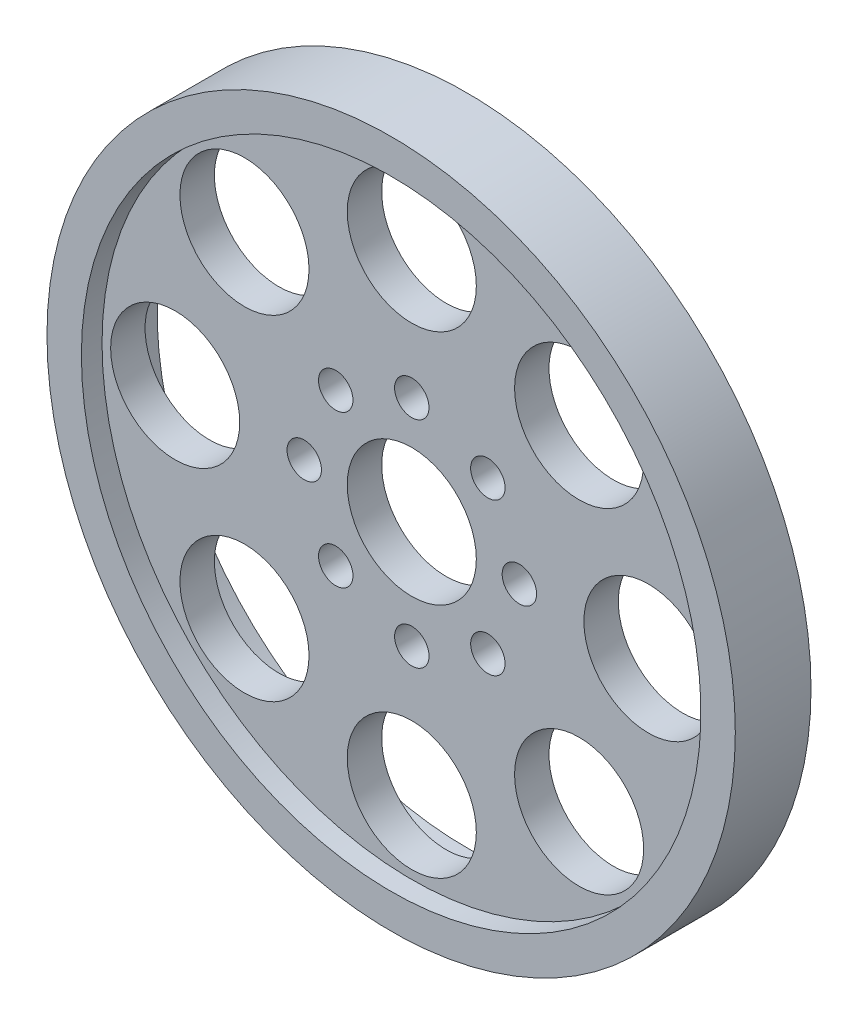
ISO-10303-21;
HEADER;
FILE_DESCRIPTION(('STEP AP214'),'2;1');
FILE_NAME('part.step','',(''),(''),'','','');
FILE_SCHEMA(('AUTOMOTIVE_DESIGN { 1 0 10303 214 1 1 1 1 }'));
ENDSEC;
DATA;
#1=APPLICATION_CONTEXT('core data for automotive mechanical design processes');
#2=APPLICATION_PROTOCOL_DEFINITION('international standard','automotive_design',2000,#1);
#3=PRODUCT_CONTEXT('',#1,'mechanical');
#4=PRODUCT('Part','Part','',(#3));
#5=PRODUCT_RELATED_PRODUCT_CATEGORY('part','',(#4));
#6=PRODUCT_DEFINITION_FORMATION('','',#4);
#7=PRODUCT_DEFINITION_CONTEXT('part definition',#1,'design');
#8=PRODUCT_DEFINITION('design','',#6,#7);
#9=PRODUCT_DEFINITION_SHAPE('','',#8);
#10=(LENGTH_UNIT() NAMED_UNIT(*) SI_UNIT(.MILLI.,.METRE.));
#11=(NAMED_UNIT(*) PLANE_ANGLE_UNIT() SI_UNIT($,.RADIAN.));
#12=(NAMED_UNIT(*) SI_UNIT($,.STERADIAN.) SOLID_ANGLE_UNIT());
#13=UNCERTAINTY_MEASURE_WITH_UNIT(LENGTH_MEASURE(1.E-05),#10,'distance_accuracy_value','');
#14=(GEOMETRIC_REPRESENTATION_CONTEXT(3) GLOBAL_UNCERTAINTY_ASSIGNED_CONTEXT((#13)) GLOBAL_UNIT_ASSIGNED_CONTEXT((#10,
#11,#12)) REPRESENTATION_CONTEXT('',''));
#15=CARTESIAN_POINT('',(0.,0.,0.));
#16=DIRECTION('',(0.,0.,1.));
#17=DIRECTION('',(1.,0.,0.));
#18=AXIS2_PLACEMENT_3D('',#15,#16,#17);
#19=CARTESIAN_POINT('',(0.,0.,2.794));
#20=DIRECTION('',(0.,0.,1.));
#21=DIRECTION('',(1.,0.,0.));
#22=AXIS2_PLACEMENT_3D('',#19,#20,#21);
#23=PLANE('',#22);
#24=CARTESIAN_POINT('',(0.,0.,2.794));
#25=DIRECTION('',(0.,0.,1.));
#26=DIRECTION('',(1.,0.,0.));
#27=AXIS2_PLACEMENT_3D('',#24,#25,#26);
#28=CIRCLE('',#27,25.4);
#29=CARTESIAN_POINT('',(25.4,0.,2.794));
#30=VERTEX_POINT('',#29);
#31=EDGE_CURVE('E10',#30,#30,#28,.T.);
#32=ORIENTED_EDGE('',*,*,#31,.T.);
#33=EDGE_LOOP('',(#32));
#34=FACE_BOUND('',#33,.T.);
#35=CARTESIAN_POINT('',(0.,0.,2.794));
#36=DIRECTION('',(0.,0.,1.));
#37=DIRECTION('',(1.,0.,0.));
#38=AXIS2_PLACEMENT_3D('',#35,#36,#37);
#39=CIRCLE('',#38,22.86);
#40=CARTESIAN_POINT('',(-22.86,0.,2.794));
#41=VERTEX_POINT('',#40);
#42=EDGE_CURVE('E60',#41,#41,#39,.F.);
#43=ORIENTED_EDGE('',*,*,#42,.T.);
#44=EDGE_LOOP('',(#43));
#45=FACE_BOUND('',#44,.T.);
#46=ADVANCED_FACE('F29',(#34,#45),#23,.T.);
#47=CARTESIAN_POINT('',(0.,0.,2.794));
#48=DIRECTION('',(0.,0.,-1.));
#49=DIRECTION('',(-1.,0.,0.));
#50=AXIS2_PLACEMENT_3D('',#47,#48,#49);
#51=CYLINDRICAL_SURFACE('',#50,25.4);
#52=ORIENTED_EDGE('',*,*,#31,.F.);
#53=EDGE_LOOP('',(#52));
#54=FACE_BOUND('',#53,.T.);
#55=CARTESIAN_POINT('',(0.,0.,-2.794));
#56=DIRECTION('',(0.,0.,1.));
#57=DIRECTION('',(1.,0.,0.));
#58=AXIS2_PLACEMENT_3D('',#55,#56,#57);
#59=CIRCLE('',#58,25.4);
#60=CARTESIAN_POINT('',(25.4,0.,-2.794));
#61=VERTEX_POINT('',#60);
#62=EDGE_CURVE('E37',#61,#61,#59,.T.);
#63=ORIENTED_EDGE('',*,*,#62,.T.);
#64=EDGE_LOOP('',(#63));
#65=FACE_BOUND('',#64,.T.);
#66=ADVANCED_FACE('F31',(#54,#65),#51,.T.);
#67=CARTESIAN_POINT('',(0.,0.,-2.794));
#68=DIRECTION('',(0.,0.,1.));
#69=DIRECTION('',(1.,0.,0.));
#70=AXIS2_PLACEMENT_3D('',#67,#68,#69);
#71=PLANE('',#70);
#72=CARTESIAN_POINT('',(0.,0.,-2.794));
#73=DIRECTION('',(0.,0.,1.));
#74=DIRECTION('',(1.,0.,0.));
#75=AXIS2_PLACEMENT_3D('',#72,#73,#74);
#76=CIRCLE('',#75,22.86);
#77=CARTESIAN_POINT('',(22.86,0.,-2.794));
#78=VERTEX_POINT('',#77);
#79=EDGE_CURVE('E42',#78,#78,#76,.T.);
#80=ORIENTED_EDGE('',*,*,#79,.T.);
#81=EDGE_LOOP('',(#80));
#82=FACE_BOUND('',#81,.T.);
#83=ORIENTED_EDGE('',*,*,#62,.F.);
#84=EDGE_LOOP('',(#83));
#85=FACE_BOUND('',#84,.T.);
#86=ADVANCED_FACE('F186',(#82,#85),#71,.F.);
#87=CARTESIAN_POINT('',(0.,0.,-2.794));
#88=DIRECTION('',(0.,0.,1.));
#89=DIRECTION('',(1.,0.,0.));
#90=AXIS2_PLACEMENT_3D('',#87,#88,#89);
#91=CYLINDRICAL_SURFACE('',#90,4.7625);
#92=CARTESIAN_POINT('',(0.,0.,1.27));
#93=DIRECTION('',(0.,0.,-1.));
#94=DIRECTION('',(-1.,0.,0.));
#95=AXIS2_PLACEMENT_3D('',#92,#93,#94);
#96=CIRCLE('',#95,4.7625);
#97=CARTESIAN_POINT('',(-4.7625,0.,1.27));
#98=VERTEX_POINT('',#97);
#99=EDGE_CURVE('E63',#98,#98,#96,.F.);
#100=ORIENTED_EDGE('',*,*,#99,.T.);
#101=EDGE_LOOP('',(#100));
#102=FACE_BOUND('',#101,.T.);
#103=CARTESIAN_POINT('',(0.,0.,-1.27));
#104=DIRECTION('',(0.,0.,1.));
#105=DIRECTION('',(1.,0.,0.));
#106=AXIS2_PLACEMENT_3D('',#103,#104,#105);
#107=CIRCLE('',#106,4.7625);
#108=CARTESIAN_POINT('',(4.7625,0.,-1.27));
#109=VERTEX_POINT('',#108);
#110=EDGE_CURVE('E45',#109,#109,#107,.F.);
#111=ORIENTED_EDGE('',*,*,#110,.T.);
#112=EDGE_LOOP('',(#111));
#113=FACE_BOUND('',#112,.T.);
#114=ADVANCED_FACE('F162',(#102,#113),#91,.F.);
#115=CARTESIAN_POINT('',(0.,7.9375,-2.794));
#116=DIRECTION('',(0.,0.,1.));
#117=DIRECTION('',(1.,0.,0.));
#118=AXIS2_PLACEMENT_3D('',#115,#116,#117);
#119=CYLINDRICAL_SURFACE('',#118,1.27);
#120=CARTESIAN_POINT('',(0.,7.9375,1.27));
#121=DIRECTION('',(0.,0.,-1.));
#122=DIRECTION('',(-1.,0.,0.));
#123=AXIS2_PLACEMENT_3D('',#120,#121,#122);
#124=CIRCLE('',#123,1.27);
#125=CARTESIAN_POINT('',(-1.27,7.9375,1.27));
#126=VERTEX_POINT('',#125);
#127=EDGE_CURVE('E132',#126,#126,#124,.F.);
#128=ORIENTED_EDGE('',*,*,#127,.T.);
#129=EDGE_LOOP('',(#128));
#130=FACE_BOUND('',#129,.T.);
#131=CARTESIAN_POINT('',(0.,7.9375,-1.27));
#132=DIRECTION('',(0.,0.,1.));
#133=DIRECTION('',(1.,0.,0.));
#134=AXIS2_PLACEMENT_3D('',#131,#132,#133);
#135=CIRCLE('',#134,1.27);
#136=CARTESIAN_POINT('',(1.27,7.9375,-1.27));
#137=VERTEX_POINT('',#136);
#138=EDGE_CURVE('E155',#137,#137,#135,.F.);
#139=ORIENTED_EDGE('',*,*,#138,.T.);
#140=EDGE_LOOP('',(#139));
#141=FACE_BOUND('',#140,.T.);
#142=ADVANCED_FACE('F196',(#130,#141),#119,.F.);
#143=CARTESIAN_POINT('',(5.61295296888708,5.61336718244947,-2.794));
#144=DIRECTION('',(0.,0.,1.));
#145=DIRECTION('',(1.,0.,0.));
#146=AXIS2_PLACEMENT_3D('',#143,#144,#145);
#147=CYLINDRICAL_SURFACE('',#146,1.27);
#148=CARTESIAN_POINT('',(5.61295296888708,5.61336718244947,1.27));
#149=DIRECTION('',(0.,0.,-1.));
#150=DIRECTION('',(-1.,0.,0.));
#151=AXIS2_PLACEMENT_3D('',#148,#149,#150);
#152=CIRCLE('',#151,1.27);
#153=CARTESIAN_POINT('',(4.34295296888708,5.61336718244947,1.27));
#154=VERTEX_POINT('',#153);
#155=EDGE_CURVE('E129',#154,#154,#152,.F.);
#156=ORIENTED_EDGE('',*,*,#155,.T.);
#157=EDGE_LOOP('',(#156));
#158=FACE_BOUND('',#157,.T.);
#159=CARTESIAN_POINT('',(5.61295296888708,5.61336718244947,-1.27));
#160=DIRECTION('',(0.,0.,1.));
#161=DIRECTION('',(1.,0.,0.));
#162=AXIS2_PLACEMENT_3D('',#159,#160,#161);
#163=CIRCLE('',#162,1.27);
#164=CARTESIAN_POINT('',(6.88295296888708,5.61336718244947,-1.27));
#165=VERTEX_POINT('',#164);
#166=EDGE_CURVE('E153',#165,#165,#163,.F.);
#167=ORIENTED_EDGE('',*,*,#166,.T.);
#168=EDGE_LOOP('',(#167));
#169=FACE_BOUND('',#168,.T.);
#170=ADVANCED_FACE('F206',(#158,#169),#147,.F.);
#171=CARTESIAN_POINT('',(7.93850000000011,0.00100000000008084,-2.794));
#172=DIRECTION('',(0.,0.,1.));
#173=DIRECTION('',(1.,0.,0.));
#174=AXIS2_PLACEMENT_3D('',#171,#172,#173);
#175=CYLINDRICAL_SURFACE('',#174,1.27);
#176=CARTESIAN_POINT('',(7.93850000000011,0.00100000000008084,1.27));
#177=DIRECTION('',(0.,0.,-1.));
#178=DIRECTION('',(-1.,0.,0.));
#179=AXIS2_PLACEMENT_3D('',#176,#177,#178);
#180=CIRCLE('',#179,1.27);
#181=CARTESIAN_POINT('',(6.66850000000011,0.00100000000008084,1.27));
#182=VERTEX_POINT('',#181);
#183=EDGE_CURVE('E126',#182,#182,#180,.F.);
#184=ORIENTED_EDGE('',*,*,#183,.T.);
#185=EDGE_LOOP('',(#184));
#186=FACE_BOUND('',#185,.T.);
#187=CARTESIAN_POINT('',(7.93850000000011,0.00100000000008084,-1.27));
#188=DIRECTION('',(0.,0.,1.));
#189=DIRECTION('',(1.,0.,0.));
#190=AXIS2_PLACEMENT_3D('',#187,#188,#189);
#191=CIRCLE('',#190,1.27);
#192=CARTESIAN_POINT('',(9.20850000000011,0.00100000000008084,-1.27));
#193=VERTEX_POINT('',#192);
#194=EDGE_CURVE('E150',#193,#193,#191,.F.);
#195=ORIENTED_EDGE('',*,*,#194,.T.);
#196=EDGE_LOOP('',(#195));
#197=FACE_BOUND('',#196,.T.);
#198=ADVANCED_FACE('F213',(#186,#197),#175,.F.);
#199=CARTESIAN_POINT('',(5.61436718244956,-5.61195296888699,-2.794));
#200=DIRECTION('',(0.,0.,1.));
#201=DIRECTION('',(1.,0.,0.));
#202=AXIS2_PLACEMENT_3D('',#199,#200,#201);
#203=CYLINDRICAL_SURFACE('',#202,1.27);
#204=CARTESIAN_POINT('',(5.61436718244956,-5.61195296888699,1.27));
#205=DIRECTION('',(0.,0.,-1.));
#206=DIRECTION('',(-1.,0.,0.));
#207=AXIS2_PLACEMENT_3D('',#204,#205,#206);
#208=CIRCLE('',#207,1.27);
#209=CARTESIAN_POINT('',(4.34436718244956,-5.61195296888699,1.27));
#210=VERTEX_POINT('',#209);
#211=EDGE_CURVE('E123',#210,#210,#208,.F.);
#212=ORIENTED_EDGE('',*,*,#211,.T.);
#213=EDGE_LOOP('',(#212));
#214=FACE_BOUND('',#213,.T.);
#215=CARTESIAN_POINT('',(5.61436718244956,-5.61195296888699,-1.27));
#216=DIRECTION('',(0.,0.,1.));
#217=DIRECTION('',(1.,0.,0.));
#218=AXIS2_PLACEMENT_3D('',#215,#216,#217);
#219=CIRCLE('',#218,1.27);
#220=CARTESIAN_POINT('',(6.88436718244956,-5.61195296888699,-1.27));
#221=VERTEX_POINT('',#220);
#222=EDGE_CURVE('E147',#221,#221,#219,.F.);
#223=ORIENTED_EDGE('',*,*,#222,.T.);
#224=EDGE_LOOP('',(#223));
#225=FACE_BOUND('',#224,.T.);
#226=ADVANCED_FACE('F219',(#214,#225),#203,.F.);
#227=CARTESIAN_POINT('',(0.00200000000015997,-7.9375,-2.794));
#228=DIRECTION('',(0.,0.,1.));
#229=DIRECTION('',(1.,0.,0.));
#230=AXIS2_PLACEMENT_3D('',#227,#228,#229);
#231=CYLINDRICAL_SURFACE('',#230,1.27);
#232=CARTESIAN_POINT('',(0.00200000000015997,-7.9375,1.27));
#233=DIRECTION('',(0.,0.,-1.));
#234=DIRECTION('',(-1.,0.,0.));
#235=AXIS2_PLACEMENT_3D('',#232,#233,#234);
#236=CIRCLE('',#235,1.27);
#237=CARTESIAN_POINT('',(-1.26799999999984,-7.9375,1.27));
#238=VERTEX_POINT('',#237);
#239=EDGE_CURVE('E120',#238,#238,#236,.F.);
#240=ORIENTED_EDGE('',*,*,#239,.T.);
#241=EDGE_LOOP('',(#240));
#242=FACE_BOUND('',#241,.T.);
#243=CARTESIAN_POINT('',(0.00200000000015997,-7.9375,-1.27));
#244=DIRECTION('',(0.,0.,1.));
#245=DIRECTION('',(1.,0.,0.));
#246=AXIS2_PLACEMENT_3D('',#243,#244,#245);
#247=CIRCLE('',#246,1.27);
#248=CARTESIAN_POINT('',(1.27200000000016,-7.9375,-1.27));
#249=VERTEX_POINT('',#248);
#250=EDGE_CURVE('E144',#249,#249,#247,.F.);
#251=ORIENTED_EDGE('',*,*,#250,.T.);
#252=EDGE_LOOP('',(#251));
#253=FACE_BOUND('',#252,.T.);
#254=ADVANCED_FACE('F223',(#242,#253),#231,.F.);
#255=CARTESIAN_POINT('',(-5.6109529688869,-5.61336718244944,-2.794));
#256=DIRECTION('',(0.,0.,1.));
#257=DIRECTION('',(1.,0.,0.));
#258=AXIS2_PLACEMENT_3D('',#255,#256,#257);
#259=CYLINDRICAL_SURFACE('',#258,1.27);
#260=CARTESIAN_POINT('',(-5.6109529688869,-5.61336718244944,1.27));
#261=DIRECTION('',(0.,0.,-1.));
#262=DIRECTION('',(-1.,0.,0.));
#263=AXIS2_PLACEMENT_3D('',#260,#261,#262);
#264=CIRCLE('',#263,1.27);
#265=CARTESIAN_POINT('',(-6.8809529688869,-5.61336718244944,1.27));
#266=VERTEX_POINT('',#265);
#267=EDGE_CURVE('E117',#266,#266,#264,.F.);
#268=ORIENTED_EDGE('',*,*,#267,.T.);
#269=EDGE_LOOP('',(#268));
#270=FACE_BOUND('',#269,.T.);
#271=CARTESIAN_POINT('',(-5.6109529688869,-5.61336718244944,-1.27));
#272=DIRECTION('',(0.,0.,1.));
#273=DIRECTION('',(1.,0.,0.));
#274=AXIS2_PLACEMENT_3D('',#271,#272,#273);
#275=CIRCLE('',#274,1.27);
#276=CARTESIAN_POINT('',(-4.3409529688869,-5.61336718244944,-1.27));
#277=VERTEX_POINT('',#276);
#278=EDGE_CURVE('E141',#277,#277,#275,.F.);
#279=ORIENTED_EDGE('',*,*,#278,.T.);
#280=EDGE_LOOP('',(#279));
#281=FACE_BOUND('',#280,.T.);
#282=ADVANCED_FACE('F227',(#270,#281),#259,.F.);
#283=CARTESIAN_POINT('',(-7.93649999999989,-0.00100000000002541,-2.794));
#284=DIRECTION('',(0.,0.,1.));
#285=DIRECTION('',(1.,0.,0.));
#286=AXIS2_PLACEMENT_3D('',#283,#284,#285);
#287=CYLINDRICAL_SURFACE('',#286,1.27);
#288=CARTESIAN_POINT('',(-7.93649999999989,-0.00100000000002541,1.27));
#289=DIRECTION('',(0.,0.,-1.));
#290=DIRECTION('',(-1.,0.,0.));
#291=AXIS2_PLACEMENT_3D('',#288,#289,#290);
#292=CIRCLE('',#291,1.27);
#293=CARTESIAN_POINT('',(-9.20649999999989,-0.00100000000002541,1.27));
#294=VERTEX_POINT('',#293);
#295=EDGE_CURVE('E58',#294,#294,#292,.F.);
#296=ORIENTED_EDGE('',*,*,#295,.T.);
#297=EDGE_LOOP('',(#296));
#298=FACE_BOUND('',#297,.T.);
#299=CARTESIAN_POINT('',(-7.93649999999989,-0.00100000000002541,-1.27));
#300=DIRECTION('',(0.,0.,1.));
#301=DIRECTION('',(1.,0.,0.));
#302=AXIS2_PLACEMENT_3D('',#299,#300,#301);
#303=CIRCLE('',#302,1.27);
#304=CARTESIAN_POINT('',(-6.66649999999989,-0.00100000000002541,-1.27));
#305=VERTEX_POINT('',#304);
#306=EDGE_CURVE('E51',#305,#305,#303,.F.);
#307=ORIENTED_EDGE('',*,*,#306,.T.);
#308=EDGE_LOOP('',(#307));
#309=FACE_BOUND('',#308,.T.);
#310=ADVANCED_FACE('F231',(#298,#309),#287,.F.);
#311=CARTESIAN_POINT('',(-5.61236718244931,5.61195296888703,-2.794));
#312=DIRECTION('',(0.,0.,1.));
#313=DIRECTION('',(1.,0.,0.));
#314=AXIS2_PLACEMENT_3D('',#311,#312,#313);
#315=CYLINDRICAL_SURFACE('',#314,1.27);
#316=CARTESIAN_POINT('',(-5.61236718244931,5.61195296888703,1.27));
#317=DIRECTION('',(0.,0.,-1.));
#318=DIRECTION('',(-1.,0.,0.));
#319=AXIS2_PLACEMENT_3D('',#316,#317,#318);
#320=CIRCLE('',#319,1.27);
#321=CARTESIAN_POINT('',(-6.88236718244931,5.61195296888703,1.27));
#322=VERTEX_POINT('',#321);
#323=EDGE_CURVE('E55',#322,#322,#320,.F.);
#324=ORIENTED_EDGE('',*,*,#323,.T.);
#325=EDGE_LOOP('',(#324));
#326=FACE_BOUND('',#325,.T.);
#327=CARTESIAN_POINT('',(-5.61236718244931,5.61195296888703,-1.27));
#328=DIRECTION('',(0.,0.,1.));
#329=DIRECTION('',(1.,0.,0.));
#330=AXIS2_PLACEMENT_3D('',#327,#328,#329);
#331=CIRCLE('',#330,1.27);
#332=CARTESIAN_POINT('',(-4.34236718244931,5.61195296888703,-1.27));
#333=VERTEX_POINT('',#332);
#334=EDGE_CURVE('E48',#333,#333,#331,.F.);
#335=ORIENTED_EDGE('',*,*,#334,.T.);
#336=EDGE_LOOP('',(#335));
#337=FACE_BOUND('',#336,.T.);
#338=ADVANCED_FACE('F176',(#326,#337),#315,.F.);
#339=CARTESIAN_POINT('',(0.,0.,-2.921));
#340=DIRECTION('',(0.,0.,1.));
#341=DIRECTION('',(1.,0.,0.));
#342=AXIS2_PLACEMENT_3D('',#339,#340,#341);
#343=CYLINDRICAL_SURFACE('',#342,22.86);
#344=CARTESIAN_POINT('',(0.,0.,-1.27));
#345=DIRECTION('',(0.,0.,1.));
#346=DIRECTION('',(1.,0.,0.));
#347=AXIS2_PLACEMENT_3D('',#344,#345,#346);
#348=CIRCLE('',#347,22.86);
#349=CARTESIAN_POINT('',(22.86,0.,-1.27));
#350=VERTEX_POINT('',#349);
#351=EDGE_CURVE('E52',#350,#350,#348,.T.);
#352=CARTESIAN_POINT('',(22.86,0.,-1.27));
#353=CARTESIAN_POINT('',(22.86,0.,-1.285875));
#354=CARTESIAN_POINT('',(22.86,0.,-1.30175));
#355=CARTESIAN_POINT('',(22.86,0.,-1.3335));
#356=CARTESIAN_POINT('',(22.86,0.,-1.349375));
#357=CARTESIAN_POINT('',(22.86,0.,-1.381125));
#358=CARTESIAN_POINT('',(22.86,0.,-1.397));
#359=CARTESIAN_POINT('',(22.86,0.,-1.42875));
#360=CARTESIAN_POINT('',(22.86,0.,-1.444625));
#361=CARTESIAN_POINT('',(22.86,0.,-1.476375));
#362=CARTESIAN_POINT('',(22.86,0.,-1.49225));
#363=CARTESIAN_POINT('',(22.86,0.,-1.524));
#364=CARTESIAN_POINT('',(22.86,0.,-1.539875));
#365=CARTESIAN_POINT('',(22.86,0.,-1.571625));
#366=CARTESIAN_POINT('',(22.86,0.,-1.5875));
#367=CARTESIAN_POINT('',(22.86,0.,-1.61925));
#368=CARTESIAN_POINT('',(22.86,0.,-1.635125));
#369=CARTESIAN_POINT('',(22.86,0.,-1.666875));
#370=CARTESIAN_POINT('',(22.86,0.,-1.68275));
#371=CARTESIAN_POINT('',(22.86,0.,-1.7145));
#372=CARTESIAN_POINT('',(22.86,0.,-1.730375));
#373=CARTESIAN_POINT('',(22.86,0.,-1.762125));
#374=CARTESIAN_POINT('',(22.86,0.,-1.778));
#375=CARTESIAN_POINT('',(22.86,0.,-1.80975));
#376=CARTESIAN_POINT('',(22.86,0.,-1.825625));
#377=CARTESIAN_POINT('',(22.86,0.,-1.857375));
#378=CARTESIAN_POINT('',(22.86,0.,-1.87325));
#379=CARTESIAN_POINT('',(22.86,0.,-1.905));
#380=CARTESIAN_POINT('',(22.86,0.,-1.920875));
#381=CARTESIAN_POINT('',(22.86,0.,-1.952625));
#382=CARTESIAN_POINT('',(22.86,0.,-1.9685));
#383=CARTESIAN_POINT('',(22.86,0.,-2.00025));
#384=CARTESIAN_POINT('',(22.86,0.,-2.016125));
#385=CARTESIAN_POINT('',(22.86,0.,-2.047875));
#386=CARTESIAN_POINT('',(22.86,0.,-2.06375));
#387=CARTESIAN_POINT('',(22.86,0.,-2.0955));
#388=CARTESIAN_POINT('',(22.86,0.,-2.111375));
#389=CARTESIAN_POINT('',(22.86,0.,-2.143125));
#390=CARTESIAN_POINT('',(22.86,0.,-2.159));
#391=CARTESIAN_POINT('',(22.86,0.,-2.19075));
#392=CARTESIAN_POINT('',(22.86,0.,-2.206625));
#393=CARTESIAN_POINT('',(22.86,0.,-2.238375));
#394=CARTESIAN_POINT('',(22.86,0.,-2.25425));
#395=CARTESIAN_POINT('',(22.86,0.,-2.286));
#396=CARTESIAN_POINT('',(22.86,0.,-2.301875));
#397=CARTESIAN_POINT('',(22.86,0.,-2.333625));
#398=CARTESIAN_POINT('',(22.86,0.,-2.3495));
#399=CARTESIAN_POINT('',(22.86,0.,-2.38125));
#400=CARTESIAN_POINT('',(22.86,0.,-2.397125));
#401=CARTESIAN_POINT('',(22.86,0.,-2.428875));
#402=CARTESIAN_POINT('',(22.86,0.,-2.44475));
#403=CARTESIAN_POINT('',(22.86,0.,-2.4765));
#404=CARTESIAN_POINT('',(22.86,0.,-2.492375));
#405=CARTESIAN_POINT('',(22.86,0.,-2.524125));
#406=CARTESIAN_POINT('',(22.86,0.,-2.54));
#407=CARTESIAN_POINT('',(22.86,0.,-2.57175));
#408=CARTESIAN_POINT('',(22.86,0.,-2.587625));
#409=CARTESIAN_POINT('',(22.86,0.,-2.619375));
#410=CARTESIAN_POINT('',(22.86,0.,-2.63525));
#411=CARTESIAN_POINT('',(22.86,0.,-2.667));
#412=CARTESIAN_POINT('',(22.86,0.,-2.682875));
#413=CARTESIAN_POINT('',(22.86,0.,-2.714625));
#414=CARTESIAN_POINT('',(22.86,0.,-2.7305));
#415=CARTESIAN_POINT('',(22.86,0.,-2.76225));
#416=CARTESIAN_POINT('',(22.86,0.,-2.778125));
#417=CARTESIAN_POINT('',(22.86,0.,-2.794));
#418=B_SPLINE_CURVE_WITH_KNOTS('',3,(#352,#353,#354,#355,#356,#357,#358,#359,#360,#361,#362,
#363,#364,#365,#366,#367,#368,#369,#370,#371,#372,#373,#374,#375,#376,#377,#378,#379,#380,#381,
#382,#383,#384,#385,#386,#387,#388,#389,#390,#391,#392,#393,#394,#395,#396,#397,#398,#399,#400,
#401,#402,#403,#404,#405,#406,#407,#408,#409,#410,#411,#412,#413,#414,#415,#416,#417),
.UNSPECIFIED.,.F.,.F.,(4,2,2,2,2,2,2,2,2,2,2,2,2,2,2,2,2,2,2,2,2,2,2,2,2,2,2,2,2,2,2,2,4),(0.,
0.0476249999999999,0.0952500000000001,0.142875,0.1905,0.238125,0.28575,0.333375,0.381,0.428625,
0.47625,0.523875,0.5715,0.619125,0.66675,0.714375,0.762,0.809625,0.85725,0.904875,0.9525,
1.000125,1.04775,1.095375,1.143,1.190625,1.23825,1.285875,1.3335,1.381125,1.42875,1.476375,
1.524),.UNSPECIFIED.);
#419=EDGE_CURVE('BSEAM167',#350,#78,#418,.T.);
#420=ORIENTED_EDGE('',*,*,#351,.T.);
#421=ORIENTED_EDGE('',*,*,#79,.F.);
#422=ORIENTED_EDGE('',*,*,#419,.T.);
#423=ORIENTED_EDGE('',*,*,#419,.F.);
#424=EDGE_LOOP('',(#420,#422,#421,#423));
#425=FACE_BOUND('',#424,.T.);
#426=ADVANCED_FACE('F167',(#425),#343,.F.);
#427=CARTESIAN_POINT('',(0.,0.,-1.27));
#428=DIRECTION('',(0.,0.,1.));
#429=DIRECTION('',(1.,0.,0.));
#430=AXIS2_PLACEMENT_3D('',#427,#428,#429);
#431=PLANE('',#430);
#432=CARTESIAN_POINT('',(-12.3478521664699,12.3478521664702,-1.27));
#433=DIRECTION('',(0.,0.,1.));
#434=DIRECTION('',(1.,0.,0.));
#435=AXIS2_PLACEMENT_3D('',#432,#433,#434);
#436=CIRCLE('',#435,4.7625);
#437=CARTESIAN_POINT('',(-7.58535216646993,12.3478521664702,-1.27));
#438=VERTEX_POINT('',#437);
#439=EDGE_CURVE('E90',#438,#438,#436,.T.);
#440=ORIENTED_EDGE('',*,*,#439,.T.);
#441=EDGE_LOOP('',(#440));
#442=FACE_BOUND('',#441,.T.);
#443=CARTESIAN_POINT('',(-17.4625,1.82909978638645E-13,-1.27));
#444=DIRECTION('',(0.,0.,1.));
#445=DIRECTION('',(1.,0.,0.));
#446=AXIS2_PLACEMENT_3D('',#443,#444,#445);
#447=CIRCLE('',#446,4.7625);
#448=CARTESIAN_POINT('',(-12.7,1.82909978638645E-13,-1.27));
#449=VERTEX_POINT('',#448);
#450=EDGE_CURVE('E87',#449,#449,#447,.T.);
#451=ORIENTED_EDGE('',*,*,#450,.T.);
#452=EDGE_LOOP('',(#451));
#453=FACE_BOUND('',#452,.T.);
#454=CARTESIAN_POINT('',(-12.3478521664702,-12.34785216647,-1.27));
#455=DIRECTION('',(0.,0.,1.));
#456=DIRECTION('',(1.,0.,0.));
#457=AXIS2_PLACEMENT_3D('',#454,#455,#456);
#458=CIRCLE('',#457,4.7625);
#459=CARTESIAN_POINT('',(-7.58535216647019,-12.34785216647,-1.27));
#460=VERTEX_POINT('',#459);
#461=EDGE_CURVE('E84',#460,#460,#458,.T.);
#462=ORIENTED_EDGE('',*,*,#461,.T.);
#463=EDGE_LOOP('',(#462));
#464=FACE_BOUND('',#463,.T.);
#465=CARTESIAN_POINT('',(-1.21939985759096E-13,-17.4625,-1.27));
#466=DIRECTION('',(0.,0.,1.));
#467=DIRECTION('',(1.,0.,0.));
#468=AXIS2_PLACEMENT_3D('',#465,#466,#467);
#469=CIRCLE('',#468,4.7625);
#470=CARTESIAN_POINT('',(4.76249999999988,-17.4625,-1.27));
#471=VERTEX_POINT('',#470);
#472=EDGE_CURVE('E80',#471,#471,#469,.T.);
#473=ORIENTED_EDGE('',*,*,#472,.T.);
#474=EDGE_LOOP('',(#473));
#475=FACE_BOUND('',#474,.T.);
#476=CARTESIAN_POINT('',(12.34785216647,-12.3478521664702,-1.27));
#477=DIRECTION('',(0.,0.,1.));
#478=DIRECTION('',(1.,0.,0.));
#479=AXIS2_PLACEMENT_3D('',#476,#477,#478);
#480=CIRCLE('',#479,4.7625);
#481=CARTESIAN_POINT('',(17.11035216647,-12.3478521664702,-1.27));
#482=VERTEX_POINT('',#481);
#483=EDGE_CURVE('E76',#482,#482,#480,.T.);
#484=ORIENTED_EDGE('',*,*,#483,.T.);
#485=EDGE_LOOP('',(#484));
#486=FACE_BOUND('',#485,.T.);
#487=CARTESIAN_POINT('',(17.4625,0.,-1.27));
#488=DIRECTION('',(0.,0.,1.));
#489=DIRECTION('',(1.,0.,0.));
#490=AXIS2_PLACEMENT_3D('',#487,#488,#489);
#491=CIRCLE('',#490,4.7625);
#492=CARTESIAN_POINT('',(22.225,0.,-1.27));
#493=VERTEX_POINT('',#492);
#494=EDGE_CURVE('E72',#493,#493,#491,.T.);
#495=ORIENTED_EDGE('',*,*,#494,.T.);
#496=EDGE_LOOP('',(#495));
#497=FACE_BOUND('',#496,.T.);
#498=CARTESIAN_POINT('',(12.3478521664701,12.3478521664701,-1.27));
#499=DIRECTION('',(0.,0.,1.));
#500=DIRECTION('',(1.,0.,0.));
#501=AXIS2_PLACEMENT_3D('',#498,#499,#500);
#502=CIRCLE('',#501,4.7625);
#503=CARTESIAN_POINT('',(17.1103521664701,12.3478521664701,-1.27));
#504=VERTEX_POINT('',#503);
#505=EDGE_CURVE('E68',#504,#504,#502,.T.);
#506=ORIENTED_EDGE('',*,*,#505,.T.);
#507=EDGE_LOOP('',(#506));
#508=FACE_BOUND('',#507,.T.);
#509=CARTESIAN_POINT('',(0.,17.4625,-1.27));
#510=DIRECTION('',(0.,0.,1.));
#511=DIRECTION('',(1.,0.,0.));
#512=AXIS2_PLACEMENT_3D('',#509,#510,#511);
#513=CIRCLE('',#512,4.7625);
#514=CARTESIAN_POINT('',(4.7625,17.4625,-1.27));
#515=VERTEX_POINT('',#514);
#516=EDGE_CURVE('E67',#515,#515,#513,.T.);
#517=ORIENTED_EDGE('',*,*,#516,.T.);
#518=EDGE_LOOP('',(#517));
#519=FACE_BOUND('',#518,.T.);
#520=ORIENTED_EDGE('',*,*,#138,.F.);
#521=EDGE_LOOP('',(#520));
#522=FACE_BOUND('',#521,.T.);
#523=ORIENTED_EDGE('',*,*,#194,.F.);
#524=EDGE_LOOP('',(#523));
#525=FACE_BOUND('',#524,.T.);
#526=ORIENTED_EDGE('',*,*,#250,.F.);
#527=EDGE_LOOP('',(#526));
#528=FACE_BOUND('',#527,.T.);
#529=ORIENTED_EDGE('',*,*,#306,.F.);
#530=EDGE_LOOP('',(#529));
#531=FACE_BOUND('',#530,.T.);
#532=ORIENTED_EDGE('',*,*,#351,.F.);
#533=EDGE_LOOP('',(#532));
#534=FACE_BOUND('',#533,.T.);
#535=ORIENTED_EDGE('',*,*,#334,.F.);
#536=EDGE_LOOP('',(#535));
#537=FACE_BOUND('',#536,.T.);
#538=ORIENTED_EDGE('',*,*,#278,.F.);
#539=EDGE_LOOP('',(#538));
#540=FACE_BOUND('',#539,.T.);
#541=ORIENTED_EDGE('',*,*,#222,.F.);
#542=EDGE_LOOP('',(#541));
#543=FACE_BOUND('',#542,.T.);
#544=ORIENTED_EDGE('',*,*,#166,.F.);
#545=EDGE_LOOP('',(#544));
#546=FACE_BOUND('',#545,.T.);
#547=ORIENTED_EDGE('',*,*,#110,.F.);
#548=EDGE_LOOP('',(#547));
#549=FACE_BOUND('',#548,.T.);
#550=ADVANCED_FACE('F164',(#442,#453,#464,#475,#486,#497,#508,#519,#522,#525,#528,#531,#534,
#537,#540,#543,#546,#549),#431,.F.);
#551=CARTESIAN_POINT('',(0.,0.,1.27));
#552=DIRECTION('',(0.,0.,-1.));
#553=DIRECTION('',(1.,0.,0.));
#554=AXIS2_PLACEMENT_3D('',#551,#552,#553);
#555=PLANE('',#554);
#556=CARTESIAN_POINT('',(-12.3478521664699,12.3478521664702,1.27));
#557=DIRECTION('',(0.,0.,-1.));
#558=DIRECTION('',(-1.,0.,0.));
#559=AXIS2_PLACEMENT_3D('',#556,#557,#558);
#560=CIRCLE('',#559,4.7625);
#561=CARTESIAN_POINT('',(-17.1103521664699,12.3478521664702,1.27));
#562=VERTEX_POINT('',#561);
#563=EDGE_CURVE('E33',#562,#562,#560,.T.);
#564=ORIENTED_EDGE('',*,*,#563,.T.);
#565=EDGE_LOOP('',(#564));
#566=FACE_BOUND('',#565,.T.);
#567=CARTESIAN_POINT('',(-17.4625,1.82909978638645E-13,1.27));
#568=DIRECTION('',(0.,0.,-1.));
#569=DIRECTION('',(-1.,0.,0.));
#570=AXIS2_PLACEMENT_3D('',#567,#568,#569);
#571=CIRCLE('',#570,4.7625);
#572=CARTESIAN_POINT('',(-22.225,1.82909978638645E-13,1.27));
#573=VERTEX_POINT('',#572);
#574=EDGE_CURVE('E88',#573,#573,#571,.T.);
#575=ORIENTED_EDGE('',*,*,#574,.T.);
#576=EDGE_LOOP('',(#575));
#577=FACE_BOUND('',#576,.T.);
#578=CARTESIAN_POINT('',(-12.3478521664702,-12.34785216647,1.27));
#579=DIRECTION('',(0.,0.,-1.));
#580=DIRECTION('',(-1.,0.,0.));
#581=AXIS2_PLACEMENT_3D('',#578,#579,#580);
#582=CIRCLE('',#581,4.7625);
#583=CARTESIAN_POINT('',(-17.1103521664702,-12.34785216647,1.27));
#584=VERTEX_POINT('',#583);
#585=EDGE_CURVE('E85',#584,#584,#582,.T.);
#586=ORIENTED_EDGE('',*,*,#585,.T.);
#587=EDGE_LOOP('',(#586));
#588=FACE_BOUND('',#587,.T.);
#589=CARTESIAN_POINT('',(-1.21939985759096E-13,-17.4625,1.27));
#590=DIRECTION('',(0.,0.,-1.));
#591=DIRECTION('',(-1.,0.,0.));
#592=AXIS2_PLACEMENT_3D('',#589,#590,#591);
#593=CIRCLE('',#592,4.7625);
#594=CARTESIAN_POINT('',(-4.76250000000012,-17.4625,1.27));
#595=VERTEX_POINT('',#594);
#596=EDGE_CURVE('E81',#595,#595,#593,.T.);
#597=ORIENTED_EDGE('',*,*,#596,.T.);
#598=EDGE_LOOP('',(#597));
#599=FACE_BOUND('',#598,.T.);
#600=CARTESIAN_POINT('',(12.34785216647,-12.3478521664702,1.27));
#601=DIRECTION('',(0.,0.,-1.));
#602=DIRECTION('',(-1.,0.,0.));
#603=AXIS2_PLACEMENT_3D('',#600,#601,#602);
#604=CIRCLE('',#603,4.7625);
#605=CARTESIAN_POINT('',(7.58535216647001,-12.3478521664702,1.27));
#606=VERTEX_POINT('',#605);
#607=EDGE_CURVE('E77',#606,#606,#604,.T.);
#608=ORIENTED_EDGE('',*,*,#607,.T.);
#609=EDGE_LOOP('',(#608));
#610=FACE_BOUND('',#609,.T.);
#611=CARTESIAN_POINT('',(17.4625,0.,1.27));
#612=DIRECTION('',(0.,0.,-1.));
#613=DIRECTION('',(-1.,0.,0.));
#614=AXIS2_PLACEMENT_3D('',#611,#612,#613);
#615=CIRCLE('',#614,4.7625);
#616=CARTESIAN_POINT('',(12.7,0.,1.27));
#617=VERTEX_POINT('',#616);
#618=EDGE_CURVE('E73',#617,#617,#615,.T.);
#619=ORIENTED_EDGE('',*,*,#618,.T.);
#620=EDGE_LOOP('',(#619));
#621=FACE_BOUND('',#620,.T.);
#622=CARTESIAN_POINT('',(12.3478521664701,12.3478521664701,1.27));
#623=DIRECTION('',(0.,0.,-1.));
#624=DIRECTION('',(-1.,0.,0.));
#625=AXIS2_PLACEMENT_3D('',#622,#623,#624);
#626=CIRCLE('',#625,4.7625);
#627=CARTESIAN_POINT('',(7.58535216647011,12.3478521664701,1.27));
#628=VERTEX_POINT('',#627);
#629=EDGE_CURVE('E69',#628,#628,#626,.T.);
#630=ORIENTED_EDGE('',*,*,#629,.T.);
#631=EDGE_LOOP('',(#630));
#632=FACE_BOUND('',#631,.T.);
#633=CARTESIAN_POINT('',(0.,17.4625,1.27));
#634=DIRECTION('',(0.,0.,-1.));
#635=DIRECTION('',(-1.,0.,0.));
#636=AXIS2_PLACEMENT_3D('',#633,#634,#635);
#637=CIRCLE('',#636,4.7625);
#638=CARTESIAN_POINT('',(-4.7625,17.4625,1.27));
#639=VERTEX_POINT('',#638);
#640=EDGE_CURVE('E64',#639,#639,#637,.T.);
#641=ORIENTED_EDGE('',*,*,#640,.T.);
#642=EDGE_LOOP('',(#641));
#643=FACE_BOUND('',#642,.T.);
#644=ORIENTED_EDGE('',*,*,#127,.F.);
#645=EDGE_LOOP('',(#644));
#646=FACE_BOUND('',#645,.T.);
#647=ORIENTED_EDGE('',*,*,#183,.F.);
#648=EDGE_LOOP('',(#647));
#649=FACE_BOUND('',#648,.T.);
#650=ORIENTED_EDGE('',*,*,#239,.F.);
#651=EDGE_LOOP('',(#650));
#652=FACE_BOUND('',#651,.T.);
#653=ORIENTED_EDGE('',*,*,#295,.F.);
#654=EDGE_LOOP('',(#653));
#655=FACE_BOUND('',#654,.T.);
#656=CARTESIAN_POINT('',(0.,0.,1.27));
#657=DIRECTION('',(0.,0.,1.));
#658=DIRECTION('',(1.,0.,0.));
#659=AXIS2_PLACEMENT_3D('',#656,#657,#658);
#660=CIRCLE('',#659,22.86);
#661=CARTESIAN_POINT('',(-22.86,0.,1.27));
#662=VERTEX_POINT('',#661);
#663=EDGE_CURVE('E59',#662,#662,#660,.T.);
#664=ORIENTED_EDGE('',*,*,#663,.T.);
#665=EDGE_LOOP('',(#664));
#666=FACE_BOUND('',#665,.T.);
#667=ORIENTED_EDGE('',*,*,#323,.F.);
#668=EDGE_LOOP('',(#667));
#669=FACE_BOUND('',#668,.T.);
#670=ORIENTED_EDGE('',*,*,#267,.F.);
#671=EDGE_LOOP('',(#670));
#672=FACE_BOUND('',#671,.T.);
#673=ORIENTED_EDGE('',*,*,#211,.F.);
#674=EDGE_LOOP('',(#673));
#675=FACE_BOUND('',#674,.T.);
#676=ORIENTED_EDGE('',*,*,#155,.F.);
#677=EDGE_LOOP('',(#676));
#678=FACE_BOUND('',#677,.T.);
#679=ORIENTED_EDGE('',*,*,#99,.F.);
#680=EDGE_LOOP('',(#679));
#681=FACE_BOUND('',#680,.T.);
#682=ADVANCED_FACE('F166',(#566,#577,#588,#599,#610,#621,#632,#643,#646,#649,#652,#655,#666,
#669,#672,#675,#678,#681),#555,.F.);
#683=CARTESIAN_POINT('',(0.,0.,2.921));
#684=DIRECTION('',(0.,0.,-1.));
#685=DIRECTION('',(-1.,0.,0.));
#686=AXIS2_PLACEMENT_3D('',#683,#684,#685);
#687=CYLINDRICAL_SURFACE('',#686,22.86);
#688=CARTESIAN_POINT('',(-22.86,0.,2.794));
#689=CARTESIAN_POINT('',(-22.86,0.,2.778125));
#690=CARTESIAN_POINT('',(-22.86,0.,2.76225));
#691=CARTESIAN_POINT('',(-22.86,0.,2.7305));
#692=CARTESIAN_POINT('',(-22.86,0.,2.714625));
#693=CARTESIAN_POINT('',(-22.86,0.,2.682875));
#694=CARTESIAN_POINT('',(-22.86,0.,2.667));
#695=CARTESIAN_POINT('',(-22.86,0.,2.63525));
#696=CARTESIAN_POINT('',(-22.86,0.,2.619375));
#697=CARTESIAN_POINT('',(-22.86,0.,2.587625));
#698=CARTESIAN_POINT('',(-22.86,0.,2.57175));
#699=CARTESIAN_POINT('',(-22.86,0.,2.54));
#700=CARTESIAN_POINT('',(-22.86,0.,2.524125));
#701=CARTESIAN_POINT('',(-22.86,0.,2.492375));
#702=CARTESIAN_POINT('',(-22.86,0.,2.4765));
#703=CARTESIAN_POINT('',(-22.86,0.,2.44475));
#704=CARTESIAN_POINT('',(-22.86,0.,2.428875));
#705=CARTESIAN_POINT('',(-22.86,0.,2.397125));
#706=CARTESIAN_POINT('',(-22.86,0.,2.38125));
#707=CARTESIAN_POINT('',(-22.86,0.,2.3495));
#708=CARTESIAN_POINT('',(-22.86,0.,2.333625));
#709=CARTESIAN_POINT('',(-22.86,0.,2.301875));
#710=CARTESIAN_POINT('',(-22.86,0.,2.286));
#711=CARTESIAN_POINT('',(-22.86,0.,2.25425));
#712=CARTESIAN_POINT('',(-22.86,0.,2.238375));
#713=CARTESIAN_POINT('',(-22.86,0.,2.206625));
#714=CARTESIAN_POINT('',(-22.86,0.,2.19075));
#715=CARTESIAN_POINT('',(-22.86,0.,2.159));
#716=CARTESIAN_POINT('',(-22.86,0.,2.143125));
#717=CARTESIAN_POINT('',(-22.86,0.,2.111375));
#718=CARTESIAN_POINT('',(-22.86,0.,2.0955));
#719=CARTESIAN_POINT('',(-22.86,0.,2.06375));
#720=CARTESIAN_POINT('',(-22.86,0.,2.047875));
#721=CARTESIAN_POINT('',(-22.86,0.,2.016125));
#722=CARTESIAN_POINT('',(-22.86,0.,2.00025));
#723=CARTESIAN_POINT('',(-22.86,0.,1.9685));
#724=CARTESIAN_POINT('',(-22.86,0.,1.952625));
#725=CARTESIAN_POINT('',(-22.86,0.,1.920875));
#726=CARTESIAN_POINT('',(-22.86,0.,1.905));
#727=CARTESIAN_POINT('',(-22.86,0.,1.87325));
#728=CARTESIAN_POINT('',(-22.86,0.,1.857375));
#729=CARTESIAN_POINT('',(-22.86,0.,1.825625));
#730=CARTESIAN_POINT('',(-22.86,0.,1.80975));
#731=CARTESIAN_POINT('',(-22.86,0.,1.778));
#732=CARTESIAN_POINT('',(-22.86,0.,1.762125));
#733=CARTESIAN_POINT('',(-22.86,0.,1.730375));
#734=CARTESIAN_POINT('',(-22.86,0.,1.7145));
#735=CARTESIAN_POINT('',(-22.86,0.,1.68275));
#736=CARTESIAN_POINT('',(-22.86,0.,1.666875));
#737=CARTESIAN_POINT('',(-22.86,0.,1.635125));
#738=CARTESIAN_POINT('',(-22.86,0.,1.61925));
#739=CARTESIAN_POINT('',(-22.86,0.,1.5875));
#740=CARTESIAN_POINT('',(-22.86,0.,1.571625));
#741=CARTESIAN_POINT('',(-22.86,0.,1.539875));
#742=CARTESIAN_POINT('',(-22.86,0.,1.524));
#743=CARTESIAN_POINT('',(-22.86,0.,1.49225));
#744=CARTESIAN_POINT('',(-22.86,0.,1.476375));
#745=CARTESIAN_POINT('',(-22.86,0.,1.444625));
#746=CARTESIAN_POINT('',(-22.86,0.,1.42875));
#747=CARTESIAN_POINT('',(-22.86,0.,1.397));
#748=CARTESIAN_POINT('',(-22.86,0.,1.381125));
#749=CARTESIAN_POINT('',(-22.86,0.,1.349375));
#750=CARTESIAN_POINT('',(-22.86,0.,1.3335));
#751=CARTESIAN_POINT('',(-22.86,0.,1.30175));
#752=CARTESIAN_POINT('',(-22.86,0.,1.285875));
#753=CARTESIAN_POINT('',(-22.86,0.,1.27));
#754=B_SPLINE_CURVE_WITH_KNOTS('',3,(#688,#689,#690,#691,#692,#693,#694,#695,#696,#697,#698,
#699,#700,#701,#702,#703,#704,#705,#706,#707,#708,#709,#710,#711,#712,#713,#714,#715,#716,#717,
#718,#719,#720,#721,#722,#723,#724,#725,#726,#727,#728,#729,#730,#731,#732,#733,#734,#735,#736,
#737,#738,#739,#740,#741,#742,#743,#744,#745,#746,#747,#748,#749,#750,#751,#752,#753),
.UNSPECIFIED.,.F.,.F.,(4,2,2,2,2,2,2,2,2,2,2,2,2,2,2,2,2,2,2,2,2,2,2,2,2,2,2,2,2,2,2,2,4),(0.,
0.0476250000000004,0.0952500000000003,0.142875,0.1905,0.238125,0.28575,0.333375,0.381,0.428625,
0.47625,0.523875,0.5715,0.619125,0.66675,0.714375,0.762,0.809625,0.85725,0.904875,0.9525,
1.000125,1.04775,1.095375,1.143,1.190625,1.23825,1.285875,1.3335,1.381125,1.42875,1.476375,
1.524),.UNSPECIFIED.);
#755=EDGE_CURVE('BSEAM173',#41,#662,#754,.T.);
#756=ORIENTED_EDGE('',*,*,#42,.F.);
#757=ORIENTED_EDGE('',*,*,#663,.F.);
#758=ORIENTED_EDGE('',*,*,#755,.T.);
#759=ORIENTED_EDGE('',*,*,#755,.F.);
#760=EDGE_LOOP('',(#756,#758,#757,#759));
#761=FACE_BOUND('',#760,.T.);
#762=ADVANCED_FACE('F173',(#761),#687,.F.);
#763=CARTESIAN_POINT('',(0.,17.4625,-2.794));
#764=DIRECTION('',(0.,0.,1.));
#765=DIRECTION('',(1.,0.,0.));
#766=AXIS2_PLACEMENT_3D('',#763,#764,#765);
#767=CYLINDRICAL_SURFACE('',#766,4.7625);
#768=ORIENTED_EDGE('',*,*,#640,.F.);
#769=EDGE_LOOP('',(#768));
#770=FACE_BOUND('',#769,.T.);
#771=ORIENTED_EDGE('',*,*,#516,.F.);
#772=EDGE_LOOP('',(#771));
#773=FACE_BOUND('',#772,.T.);
#774=ADVANCED_FACE('F343',(#770,#773),#767,.F.);
#775=CARTESIAN_POINT('',(12.3478521664701,12.3478521664701,-2.794));
#776=DIRECTION('',(0.,0.,1.));
#777=DIRECTION('',(1.,0.,0.));
#778=AXIS2_PLACEMENT_3D('',#775,#776,#777);
#779=CYLINDRICAL_SURFACE('',#778,4.7625);
#780=ORIENTED_EDGE('',*,*,#629,.F.);
#781=EDGE_LOOP('',(#780));
#782=FACE_BOUND('',#781,.T.);
#783=ORIENTED_EDGE('',*,*,#505,.F.);
#784=EDGE_LOOP('',(#783));
#785=FACE_BOUND('',#784,.T.);
#786=ADVANCED_FACE('F350',(#782,#785),#779,.F.);
#787=CARTESIAN_POINT('',(17.4625,0.,-2.794));
#788=DIRECTION('',(0.,0.,1.));
#789=DIRECTION('',(1.,0.,0.));
#790=AXIS2_PLACEMENT_3D('',#787,#788,#789);
#791=CYLINDRICAL_SURFACE('',#790,4.7625);
#792=ORIENTED_EDGE('',*,*,#618,.F.);
#793=EDGE_LOOP('',(#792));
#794=FACE_BOUND('',#793,.T.);
#795=ORIENTED_EDGE('',*,*,#494,.F.);
#796=EDGE_LOOP('',(#795));
#797=FACE_BOUND('',#796,.T.);
#798=ADVANCED_FACE('F359',(#794,#797),#791,.F.);
#799=CARTESIAN_POINT('',(12.34785216647,-12.3478521664702,-2.794));
#800=DIRECTION('',(0.,0.,1.));
#801=DIRECTION('',(1.,0.,0.));
#802=AXIS2_PLACEMENT_3D('',#799,#800,#801);
#803=CYLINDRICAL_SURFACE('',#802,4.7625);
#804=ORIENTED_EDGE('',*,*,#607,.F.);
#805=EDGE_LOOP('',(#804));
#806=FACE_BOUND('',#805,.T.);
#807=ORIENTED_EDGE('',*,*,#483,.F.);
#808=EDGE_LOOP('',(#807));
#809=FACE_BOUND('',#808,.T.);
#810=ADVANCED_FACE('F368',(#806,#809),#803,.F.);
#811=CARTESIAN_POINT('',(-1.21939985759096E-13,-17.4625,-2.794));
#812=DIRECTION('',(0.,0.,1.));
#813=DIRECTION('',(1.,0.,0.));
#814=AXIS2_PLACEMENT_3D('',#811,#812,#813);
#815=CYLINDRICAL_SURFACE('',#814,4.7625);
#816=ORIENTED_EDGE('',*,*,#596,.F.);
#817=EDGE_LOOP('',(#816));
#818=FACE_BOUND('',#817,.T.);
#819=ORIENTED_EDGE('',*,*,#472,.F.);
#820=EDGE_LOOP('',(#819));
#821=FACE_BOUND('',#820,.T.);
#822=ADVANCED_FACE('F377',(#818,#821),#815,.F.);
#823=CARTESIAN_POINT('',(-12.3478521664702,-12.34785216647,-2.794));
#824=DIRECTION('',(0.,0.,1.));
#825=DIRECTION('',(1.,0.,0.));
#826=AXIS2_PLACEMENT_3D('',#823,#824,#825);
#827=CYLINDRICAL_SURFACE('',#826,4.7625);
#828=ORIENTED_EDGE('',*,*,#585,.F.);
#829=EDGE_LOOP('',(#828));
#830=FACE_BOUND('',#829,.T.);
#831=ORIENTED_EDGE('',*,*,#461,.F.);
#832=EDGE_LOOP('',(#831));
#833=FACE_BOUND('',#832,.T.);
#834=ADVANCED_FACE('F386',(#830,#833),#827,.F.);
#835=CARTESIAN_POINT('',(-17.4625,1.82909978638645E-13,-2.794));
#836=DIRECTION('',(0.,0.,1.));
#837=DIRECTION('',(1.,0.,0.));
#838=AXIS2_PLACEMENT_3D('',#835,#836,#837);
#839=CYLINDRICAL_SURFACE('',#838,4.7625);
#840=ORIENTED_EDGE('',*,*,#574,.F.);
#841=EDGE_LOOP('',(#840));
#842=FACE_BOUND('',#841,.T.);
#843=ORIENTED_EDGE('',*,*,#450,.F.);
#844=EDGE_LOOP('',(#843));
#845=FACE_BOUND('',#844,.T.);
#846=ADVANCED_FACE('F395',(#842,#845),#839,.F.);
#847=CARTESIAN_POINT('',(-12.3478521664699,12.3478521664702,-2.794));
#848=DIRECTION('',(0.,0.,1.));
#849=DIRECTION('',(1.,0.,0.));
#850=AXIS2_PLACEMENT_3D('',#847,#848,#849);
#851=CYLINDRICAL_SURFACE('',#850,4.7625);
#852=ORIENTED_EDGE('',*,*,#563,.F.);
#853=EDGE_LOOP('',(#852));
#854=FACE_BOUND('',#853,.T.);
#855=ORIENTED_EDGE('',*,*,#439,.F.);
#856=EDGE_LOOP('',(#855));
#857=FACE_BOUND('',#856,.T.);
#858=ADVANCED_FACE('F404',(#854,#857),#851,.F.);
#859=CLOSED_SHELL('',(#46,#66,#86,#114,#142,#170,#198,#226,#254,#282,#310,#338,#426,#550,#682,
#762,#774,#786,#798,#810,#822,#834,#846,#858));
#860=MANIFOLD_SOLID_BREP('B2',#859);
#861=ADVANCED_BREP_SHAPE_REPRESENTATION('',(#18,#860),#14);
#862=SHAPE_DEFINITION_REPRESENTATION(#9,#861);
ENDSEC;
END-ISO-10303-21;
